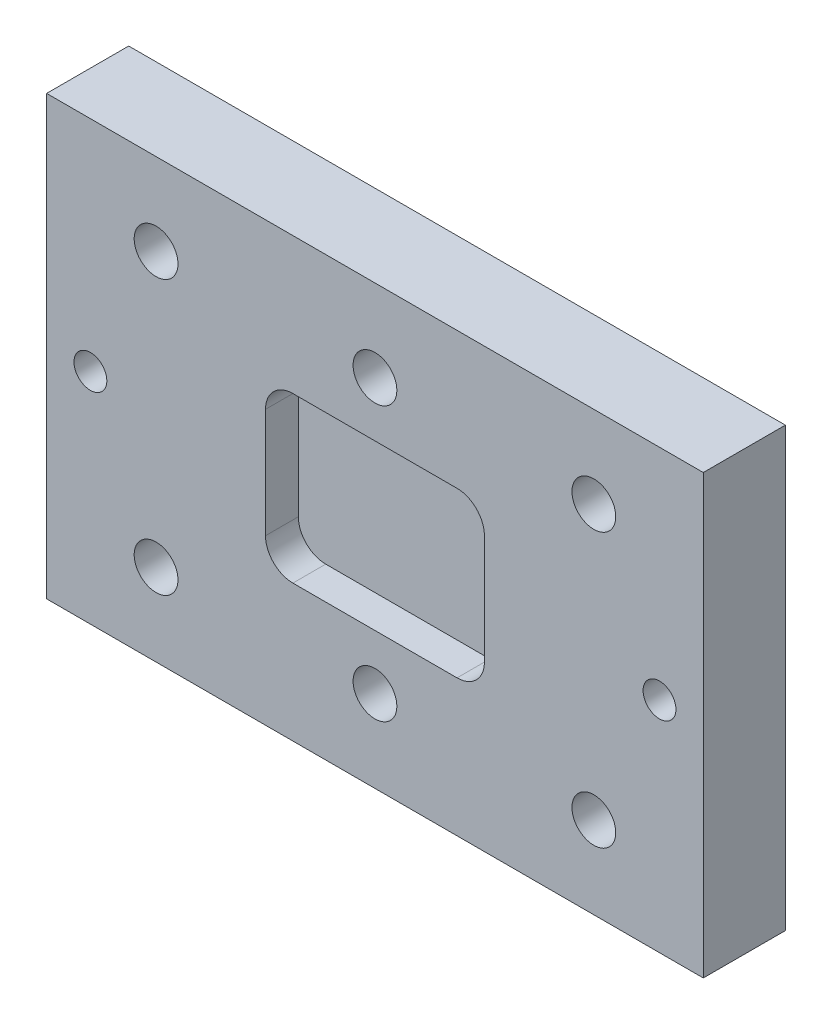
ISO-10303-21;
HEADER;
FILE_DESCRIPTION(('STEP AP214'),'2;1');
FILE_NAME('part.step','',(''),(''),'','','');
FILE_SCHEMA(('AUTOMOTIVE_DESIGN { 1 0 10303 214 1 1 1 1 }'));
ENDSEC;
DATA;
#1=APPLICATION_CONTEXT('core data for automotive mechanical design processes');
#2=APPLICATION_PROTOCOL_DEFINITION('international standard','automotive_design',2000,#1);
#3=PRODUCT_CONTEXT('',#1,'mechanical');
#4=PRODUCT('Part','Part','',(#3));
#5=PRODUCT_RELATED_PRODUCT_CATEGORY('part','',(#4));
#6=PRODUCT_DEFINITION_FORMATION('','',#4);
#7=PRODUCT_DEFINITION_CONTEXT('part definition',#1,'design');
#8=PRODUCT_DEFINITION('design','',#6,#7);
#9=PRODUCT_DEFINITION_SHAPE('','',#8);
#10=(LENGTH_UNIT() NAMED_UNIT(*) SI_UNIT(.MILLI.,.METRE.));
#11=(NAMED_UNIT(*) PLANE_ANGLE_UNIT() SI_UNIT($,.RADIAN.));
#12=(NAMED_UNIT(*) SI_UNIT($,.STERADIAN.) SOLID_ANGLE_UNIT());
#13=UNCERTAINTY_MEASURE_WITH_UNIT(LENGTH_MEASURE(1.E-05),#10,'distance_accuracy_value','');
#14=(GEOMETRIC_REPRESENTATION_CONTEXT(3) GLOBAL_UNCERTAINTY_ASSIGNED_CONTEXT((#13)) GLOBAL_UNIT_ASSIGNED_CONTEXT((#10,
#11,#12)) REPRESENTATION_CONTEXT('',''));
#15=CARTESIAN_POINT('',(0.,0.,0.));
#16=DIRECTION('',(0.,0.,1.));
#17=DIRECTION('',(1.,0.,0.));
#18=AXIS2_PLACEMENT_3D('',#15,#16,#17);
#19=CARTESIAN_POINT('',(-60.,40.,15.));
#20=DIRECTION('',(1.,0.,0.));
#21=DIRECTION('',(0.,0.,-1.));
#22=AXIS2_PLACEMENT_3D('',#19,#20,#21);
#23=PLANE('',#22);
#24=DIRECTION('',(0.,-1.,0.));
#25=VECTOR('',#24,1.);
#26=CARTESIAN_POINT('',(-60.,40.,0.));
#27=LINE('',#26,#25);
#28=CARTESIAN_POINT('',(-60.,40.,0.));
#29=VERTEX_POINT('',#28);
#30=CARTESIAN_POINT('',(-60.,-40.,0.));
#31=VERTEX_POINT('',#30);
#32=EDGE_CURVE('E230',#29,#31,#27,.T.);
#33=ORIENTED_EDGE('',*,*,#32,.T.);
#34=DIRECTION('',(0.,0.,-1.));
#35=VECTOR('',#34,1.);
#36=CARTESIAN_POINT('',(-60.,-40.,15.));
#37=LINE('',#36,#35);
#38=CARTESIAN_POINT('',(-60.,-40.,15.));
#39=VERTEX_POINT('',#38);
#40=EDGE_CURVE('E11',#39,#31,#37,.T.);
#41=ORIENTED_EDGE('',*,*,#40,.F.);
#42=DIRECTION('',(0.,-1.,0.));
#43=VECTOR('',#42,1.);
#44=CARTESIAN_POINT('',(-60.,40.,15.));
#45=LINE('',#44,#43);
#46=CARTESIAN_POINT('',(-60.,40.,15.));
#47=VERTEX_POINT('',#46);
#48=EDGE_CURVE('E248',#47,#39,#45,.T.);
#49=ORIENTED_EDGE('',*,*,#48,.F.);
#50=DIRECTION('',(0.,0.,-1.));
#51=VECTOR('',#50,1.);
#52=CARTESIAN_POINT('',(-60.,40.,15.));
#53=LINE('',#52,#51);
#54=EDGE_CURVE('E258',#47,#29,#53,.T.);
#55=ORIENTED_EDGE('',*,*,#54,.T.);
#56=EDGE_LOOP('',(#33,#41,#49,#55));
#57=FACE_BOUND('',#56,.T.);
#58=ADVANCED_FACE('F51',(#57),#23,.F.);
#59=CARTESIAN_POINT('',(-60.,-40.,15.));
#60=DIRECTION('',(0.,1.,0.));
#61=DIRECTION('',(0.,0.,1.));
#62=AXIS2_PLACEMENT_3D('',#59,#60,#61);
#63=PLANE('',#62);
#64=DIRECTION('',(1.,0.,0.));
#65=VECTOR('',#64,1.);
#66=CARTESIAN_POINT('',(-60.,-40.,0.));
#67=LINE('',#66,#65);
#68=CARTESIAN_POINT('',(60.,-40.,0.));
#69=VERTEX_POINT('',#68);
#70=EDGE_CURVE('E262',#31,#69,#67,.T.);
#71=ORIENTED_EDGE('',*,*,#70,.T.);
#72=DIRECTION('',(0.,0.,-1.));
#73=VECTOR('',#72,1.);
#74=CARTESIAN_POINT('',(60.,-40.,15.));
#75=LINE('',#74,#73);
#76=CARTESIAN_POINT('',(60.,-40.,15.));
#77=VERTEX_POINT('',#76);
#78=EDGE_CURVE('E59',#77,#69,#75,.T.);
#79=ORIENTED_EDGE('',*,*,#78,.F.);
#80=DIRECTION('',(1.,0.,0.));
#81=VECTOR('',#80,1.);
#82=CARTESIAN_POINT('',(-60.,-40.,15.));
#83=LINE('',#82,#81);
#84=EDGE_CURVE('E103',#39,#77,#83,.T.);
#85=ORIENTED_EDGE('',*,*,#84,.F.);
#86=ORIENTED_EDGE('',*,*,#40,.T.);
#87=EDGE_LOOP('',(#71,#79,#85,#86));
#88=FACE_BOUND('',#87,.T.);
#89=ADVANCED_FACE('F297',(#88),#63,.F.);
#90=CARTESIAN_POINT('',(60.,-40.,15.));
#91=DIRECTION('',(-1.,0.,0.));
#92=DIRECTION('',(0.,0.,1.));
#93=AXIS2_PLACEMENT_3D('',#90,#91,#92);
#94=PLANE('',#93);
#95=DIRECTION('',(0.,1.,0.));
#96=VECTOR('',#95,1.);
#97=CARTESIAN_POINT('',(60.,-40.,0.));
#98=LINE('',#97,#96);
#99=CARTESIAN_POINT('',(60.,40.,0.));
#100=VERTEX_POINT('',#99);
#101=EDGE_CURVE('E265',#69,#100,#98,.T.);
#102=ORIENTED_EDGE('',*,*,#101,.T.);
#103=DIRECTION('',(0.,0.,-1.));
#104=VECTOR('',#103,1.);
#105=CARTESIAN_POINT('',(60.,40.,15.));
#106=LINE('',#105,#104);
#107=CARTESIAN_POINT('',(60.,40.,15.));
#108=VERTEX_POINT('',#107);
#109=EDGE_CURVE('E272',#108,#100,#106,.T.);
#110=ORIENTED_EDGE('',*,*,#109,.F.);
#111=DIRECTION('',(0.,1.,0.));
#112=VECTOR('',#111,1.);
#113=CARTESIAN_POINT('',(60.,-40.,15.));
#114=LINE('',#113,#112);
#115=EDGE_CURVE('E253',#77,#108,#114,.T.);
#116=ORIENTED_EDGE('',*,*,#115,.F.);
#117=ORIENTED_EDGE('',*,*,#78,.T.);
#118=EDGE_LOOP('',(#102,#110,#116,#117));
#119=FACE_BOUND('',#118,.T.);
#120=ADVANCED_FACE('F280',(#119),#94,.F.);
#121=CARTESIAN_POINT('',(60.,40.,15.));
#122=DIRECTION('',(0.,-1.,0.));
#123=DIRECTION('',(0.,0.,-1.));
#124=AXIS2_PLACEMENT_3D('',#121,#122,#123);
#125=PLANE('',#124);
#126=DIRECTION('',(-1.,0.,0.));
#127=VECTOR('',#126,1.);
#128=CARTESIAN_POINT('',(60.,40.,0.));
#129=LINE('',#128,#127);
#130=EDGE_CURVE('E96',#100,#29,#129,.T.);
#131=ORIENTED_EDGE('',*,*,#130,.T.);
#132=ORIENTED_EDGE('',*,*,#54,.F.);
#133=DIRECTION('',(-1.,0.,0.));
#134=VECTOR('',#133,1.);
#135=CARTESIAN_POINT('',(60.,40.,15.));
#136=LINE('',#135,#134);
#137=EDGE_CURVE('E75',#108,#47,#136,.T.);
#138=ORIENTED_EDGE('',*,*,#137,.F.);
#139=ORIENTED_EDGE('',*,*,#109,.T.);
#140=EDGE_LOOP('',(#131,#132,#138,#139));
#141=FACE_BOUND('',#140,.T.);
#142=ADVANCED_FACE('F288',(#141),#125,.F.);
#143=CARTESIAN_POINT('',(0.,0.,15.));
#144=DIRECTION('',(0.,0.,1.));
#145=DIRECTION('',(1.,0.,0.));
#146=AXIS2_PLACEMENT_3D('',#143,#144,#145);
#147=PLANE('',#146);
#148=CARTESIAN_POINT('',(52.,0.,15.));
#149=DIRECTION('',(0.,0.,1.));
#150=DIRECTION('',(1.,0.,0.));
#151=AXIS2_PLACEMENT_3D('',#148,#149,#150);
#152=CIRCLE('',#151,3.);
#153=CARTESIAN_POINT('',(55.,0.,15.));
#154=VERTEX_POINT('',#153);
#155=EDGE_CURVE('E599',#154,#154,#152,.T.);
#156=ORIENTED_EDGE('',*,*,#155,.F.);
#157=EDGE_LOOP('',(#156));
#158=FACE_BOUND('',#157,.T.);
#159=CARTESIAN_POINT('',(-52.,0.,15.));
#160=DIRECTION('',(0.,0.,1.));
#161=DIRECTION('',(1.,0.,0.));
#162=AXIS2_PLACEMENT_3D('',#159,#160,#161);
#163=CIRCLE('',#162,3.);
#164=CARTESIAN_POINT('',(-49.,0.,15.));
#165=VERTEX_POINT('',#164);
#166=EDGE_CURVE('E607',#165,#165,#163,.T.);
#167=ORIENTED_EDGE('',*,*,#166,.F.);
#168=EDGE_LOOP('',(#167));
#169=FACE_BOUND('',#168,.T.);
#170=CARTESIAN_POINT('',(-40.,25.,15.));
#171=DIRECTION('',(0.,0.,1.));
#172=DIRECTION('',(1.,0.,0.));
#173=AXIS2_PLACEMENT_3D('',#170,#171,#172);
#174=CIRCLE('',#173,4.);
#175=CARTESIAN_POINT('',(-36.,25.,15.));
#176=VERTEX_POINT('',#175);
#177=EDGE_CURVE('E630',#176,#176,#174,.T.);
#178=ORIENTED_EDGE('',*,*,#177,.F.);
#179=EDGE_LOOP('',(#178));
#180=FACE_BOUND('',#179,.T.);
#181=CARTESIAN_POINT('',(40.,-25.,15.));
#182=DIRECTION('',(0.,0.,1.));
#183=DIRECTION('',(1.,0.,0.));
#184=AXIS2_PLACEMENT_3D('',#181,#182,#183);
#185=CIRCLE('',#184,4.);
#186=CARTESIAN_POINT('',(44.,-25.,15.));
#187=VERTEX_POINT('',#186);
#188=EDGE_CURVE('E621',#187,#187,#185,.T.);
#189=ORIENTED_EDGE('',*,*,#188,.F.);
#190=EDGE_LOOP('',(#189));
#191=FACE_BOUND('',#190,.T.);
#192=CARTESIAN_POINT('',(40.,25.,15.));
#193=DIRECTION('',(0.,0.,1.));
#194=DIRECTION('',(1.,0.,0.));
#195=AXIS2_PLACEMENT_3D('',#192,#193,#194);
#196=CIRCLE('',#195,4.);
#197=CARTESIAN_POINT('',(44.,25.,15.));
#198=VERTEX_POINT('',#197);
#199=EDGE_CURVE('E645',#198,#198,#196,.T.);
#200=ORIENTED_EDGE('',*,*,#199,.F.);
#201=EDGE_LOOP('',(#200));
#202=FACE_BOUND('',#201,.T.);
#203=CARTESIAN_POINT('',(0.,-25.,15.));
#204=DIRECTION('',(0.,0.,1.));
#205=DIRECTION('',(1.,0.,0.));
#206=AXIS2_PLACEMENT_3D('',#203,#204,#205);
#207=CIRCLE('',#206,4.);
#208=CARTESIAN_POINT('',(4.,-25.,15.));
#209=VERTEX_POINT('',#208);
#210=EDGE_CURVE('E637',#209,#209,#207,.T.);
#211=ORIENTED_EDGE('',*,*,#210,.F.);
#212=EDGE_LOOP('',(#211));
#213=FACE_BOUND('',#212,.T.);
#214=CARTESIAN_POINT('',(-40.,-25.,15.));
#215=DIRECTION('',(0.,0.,1.));
#216=DIRECTION('',(1.,0.,0.));
#217=AXIS2_PLACEMENT_3D('',#214,#215,#216);
#218=CIRCLE('',#217,4.);
#219=CARTESIAN_POINT('',(-36.,-25.,15.));
#220=VERTEX_POINT('',#219);
#221=EDGE_CURVE('E603',#220,#220,#218,.T.);
#222=ORIENTED_EDGE('',*,*,#221,.F.);
#223=EDGE_LOOP('',(#222));
#224=FACE_BOUND('',#223,.T.);
#225=CARTESIAN_POINT('',(0.,25.,15.));
#226=DIRECTION('',(0.,0.,1.));
#227=DIRECTION('',(1.,0.,0.));
#228=AXIS2_PLACEMENT_3D('',#225,#226,#227);
#229=CIRCLE('',#228,4.);
#230=CARTESIAN_POINT('',(4.,25.,15.));
#231=VERTEX_POINT('',#230);
#232=EDGE_CURVE('E180',#231,#231,#229,.T.);
#233=ORIENTED_EDGE('',*,*,#232,.F.);
#234=EDGE_LOOP('',(#233));
#235=FACE_BOUND('',#234,.T.);
#236=CARTESIAN_POINT('',(-15.,-9.99999999999999,15.));
#237=DIRECTION('',(0.,0.,1.));
#238=DIRECTION('',(1.,0.,0.));
#239=AXIS2_PLACEMENT_3D('',#236,#237,#238);
#240=CIRCLE('',#239,5.);
#241=CARTESIAN_POINT('',(-20.,-10.,15.));
#242=VERTEX_POINT('',#241);
#243=CARTESIAN_POINT('',(-15.,-15.,15.));
#244=VERTEX_POINT('',#243);
#245=EDGE_CURVE('E66',#242,#244,#240,.T.);
#246=ORIENTED_EDGE('',*,*,#245,.F.);
#247=DIRECTION('',(0.,-1.,0.));
#248=VECTOR('',#247,1.);
#249=CARTESIAN_POINT('',(-20.,10.,15.));
#250=LINE('',#249,#248);
#251=CARTESIAN_POINT('',(-20.,10.,15.));
#252=VERTEX_POINT('',#251);
#253=EDGE_CURVE('E173',#252,#242,#250,.T.);
#254=ORIENTED_EDGE('',*,*,#253,.F.);
#255=CARTESIAN_POINT('',(-15.,9.99999999999999,15.));
#256=DIRECTION('',(0.,0.,1.));
#257=DIRECTION('',(1.,0.,0.));
#258=AXIS2_PLACEMENT_3D('',#255,#256,#257);
#259=CIRCLE('',#258,5.);
#260=CARTESIAN_POINT('',(-15.,15.,15.));
#261=VERTEX_POINT('',#260);
#262=EDGE_CURVE('E177',#261,#252,#259,.T.);
#263=ORIENTED_EDGE('',*,*,#262,.F.);
#264=DIRECTION('',(-1.,0.,0.));
#265=VECTOR('',#264,1.);
#266=CARTESIAN_POINT('',(15.,15.,15.));
#267=LINE('',#266,#265);
#268=CARTESIAN_POINT('',(15.,15.,15.));
#269=VERTEX_POINT('',#268);
#270=EDGE_CURVE('E220',#269,#261,#267,.T.);
#271=ORIENTED_EDGE('',*,*,#270,.F.);
#272=CARTESIAN_POINT('',(15.,9.99999999999999,15.));
#273=DIRECTION('',(0.,0.,1.));
#274=DIRECTION('',(1.,0.,0.));
#275=AXIS2_PLACEMENT_3D('',#272,#273,#274);
#276=CIRCLE('',#275,5.);
#277=CARTESIAN_POINT('',(20.,10.,15.));
#278=VERTEX_POINT('',#277);
#279=EDGE_CURVE('E216',#278,#269,#276,.T.);
#280=ORIENTED_EDGE('',*,*,#279,.F.);
#281=DIRECTION('',(0.,1.,0.));
#282=VECTOR('',#281,1.);
#283=CARTESIAN_POINT('',(20.,-10.,15.));
#284=LINE('',#283,#282);
#285=CARTESIAN_POINT('',(20.,-10.,15.));
#286=VERTEX_POINT('',#285);
#287=EDGE_CURVE('E212',#286,#278,#284,.T.);
#288=ORIENTED_EDGE('',*,*,#287,.F.);
#289=CARTESIAN_POINT('',(15.,-9.99999999999999,15.));
#290=DIRECTION('',(0.,0.,1.));
#291=DIRECTION('',(1.,0.,0.));
#292=AXIS2_PLACEMENT_3D('',#289,#290,#291);
#293=CIRCLE('',#292,5.);
#294=CARTESIAN_POINT('',(15.,-15.,15.));
#295=VERTEX_POINT('',#294);
#296=EDGE_CURVE('E208',#295,#286,#293,.T.);
#297=ORIENTED_EDGE('',*,*,#296,.F.);
#298=DIRECTION('',(1.,0.,0.));
#299=VECTOR('',#298,1.);
#300=CARTESIAN_POINT('',(-15.,-15.,15.));
#301=LINE('',#300,#299);
#302=EDGE_CURVE('E204',#244,#295,#301,.T.);
#303=ORIENTED_EDGE('',*,*,#302,.F.);
#304=EDGE_LOOP('',(#246,#254,#263,#271,#280,#288,#297,#303));
#305=FACE_BOUND('',#304,.T.);
#306=ORIENTED_EDGE('',*,*,#48,.T.);
#307=ORIENTED_EDGE('',*,*,#84,.T.);
#308=ORIENTED_EDGE('',*,*,#115,.T.);
#309=ORIENTED_EDGE('',*,*,#137,.T.);
#310=EDGE_LOOP('',(#306,#307,#308,#309));
#311=FACE_BOUND('',#310,.T.);
#312=ADVANCED_FACE('F290',(#158,#169,#180,#191,#202,#213,#224,#235,#305,#311),#147,.T.);
#313=CARTESIAN_POINT('',(0.,0.,0.));
#314=DIRECTION('',(0.,0.,1.));
#315=DIRECTION('',(1.,0.,0.));
#316=AXIS2_PLACEMENT_3D('',#313,#314,#315);
#317=PLANE('',#316);
#318=CARTESIAN_POINT('',(-40.,25.,0.));
#319=DIRECTION('',(0.,0.,1.));
#320=DIRECTION('',(1.,0.,0.));
#321=AXIS2_PLACEMENT_3D('',#318,#319,#320);
#322=CIRCLE('',#321,4.);
#323=CARTESIAN_POINT('',(-36.,25.,0.));
#324=VERTEX_POINT('',#323);
#325=EDGE_CURVE('E619',#324,#324,#322,.T.);
#326=ORIENTED_EDGE('',*,*,#325,.T.);
#327=EDGE_LOOP('',(#326));
#328=FACE_BOUND('',#327,.T.);
#329=CARTESIAN_POINT('',(40.,-25.,0.));
#330=DIRECTION('',(0.,0.,1.));
#331=DIRECTION('',(1.,0.,0.));
#332=AXIS2_PLACEMENT_3D('',#329,#330,#331);
#333=CIRCLE('',#332,4.);
#334=CARTESIAN_POINT('',(44.,-25.,0.));
#335=VERTEX_POINT('',#334);
#336=EDGE_CURVE('E626',#335,#335,#333,.T.);
#337=ORIENTED_EDGE('',*,*,#336,.T.);
#338=EDGE_LOOP('',(#337));
#339=FACE_BOUND('',#338,.T.);
#340=CARTESIAN_POINT('',(40.,25.,0.));
#341=DIRECTION('',(0.,0.,1.));
#342=DIRECTION('',(1.,0.,0.));
#343=AXIS2_PLACEMENT_3D('',#340,#341,#342);
#344=CIRCLE('',#343,4.);
#345=CARTESIAN_POINT('',(44.,25.,0.));
#346=VERTEX_POINT('',#345);
#347=EDGE_CURVE('E625',#346,#346,#344,.T.);
#348=ORIENTED_EDGE('',*,*,#347,.T.);
#349=EDGE_LOOP('',(#348));
#350=FACE_BOUND('',#349,.T.);
#351=CARTESIAN_POINT('',(0.,-25.,0.));
#352=DIRECTION('',(0.,0.,1.));
#353=DIRECTION('',(1.,0.,0.));
#354=AXIS2_PLACEMENT_3D('',#351,#352,#353);
#355=CIRCLE('',#354,4.);
#356=CARTESIAN_POINT('',(4.,-25.,0.));
#357=VERTEX_POINT('',#356);
#358=EDGE_CURVE('E641',#357,#357,#355,.T.);
#359=ORIENTED_EDGE('',*,*,#358,.T.);
#360=EDGE_LOOP('',(#359));
#361=FACE_BOUND('',#360,.T.);
#362=CARTESIAN_POINT('',(-40.,-25.,0.));
#363=DIRECTION('',(0.,0.,1.));
#364=DIRECTION('',(1.,0.,0.));
#365=AXIS2_PLACEMENT_3D('',#362,#363,#364);
#366=CIRCLE('',#365,4.);
#367=CARTESIAN_POINT('',(-36.,-25.,0.));
#368=VERTEX_POINT('',#367);
#369=EDGE_CURVE('E598',#368,#368,#366,.T.);
#370=ORIENTED_EDGE('',*,*,#369,.T.);
#371=EDGE_LOOP('',(#370));
#372=FACE_BOUND('',#371,.T.);
#373=CARTESIAN_POINT('',(0.,25.,0.));
#374=DIRECTION('',(0.,0.,1.));
#375=DIRECTION('',(1.,0.,0.));
#376=AXIS2_PLACEMENT_3D('',#373,#374,#375);
#377=CIRCLE('',#376,4.);
#378=CARTESIAN_POINT('',(4.,25.,0.));
#379=VERTEX_POINT('',#378);
#380=EDGE_CURVE('E205',#379,#379,#377,.T.);
#381=ORIENTED_EDGE('',*,*,#380,.T.);
#382=EDGE_LOOP('',(#381));
#383=FACE_BOUND('',#382,.T.);
#384=ORIENTED_EDGE('',*,*,#32,.F.);
#385=ORIENTED_EDGE('',*,*,#130,.F.);
#386=ORIENTED_EDGE('',*,*,#101,.F.);
#387=ORIENTED_EDGE('',*,*,#70,.F.);
#388=EDGE_LOOP('',(#384,#385,#386,#387));
#389=FACE_BOUND('',#388,.T.);
#390=ADVANCED_FACE('F284',(#328,#339,#350,#361,#372,#383,#389),#317,.F.);
#391=CARTESIAN_POINT('',(-15.,-9.99999999999999,9.));
#392=DIRECTION('',(0.,0.,1.));
#393=DIRECTION('',(1.,0.,0.));
#394=AXIS2_PLACEMENT_3D('',#391,#392,#393);
#395=CYLINDRICAL_SURFACE('',#394,5.);
#396=ORIENTED_EDGE('',*,*,#245,.T.);
#397=DIRECTION('',(0.,0.,1.));
#398=VECTOR('',#397,1.);
#399=CARTESIAN_POINT('',(-15.,-15.,9.));
#400=LINE('',#399,#398);
#401=CARTESIAN_POINT('',(-15.,-15.,9.));
#402=VERTEX_POINT('',#401);
#403=EDGE_CURVE('E147',#402,#244,#400,.T.);
#404=ORIENTED_EDGE('',*,*,#403,.F.);
#405=CARTESIAN_POINT('',(-15.,-9.99999999999999,9.));
#406=DIRECTION('',(0.,0.,1.));
#407=DIRECTION('',(1.,0.,0.));
#408=AXIS2_PLACEMENT_3D('',#405,#406,#407);
#409=CIRCLE('',#408,5.);
#410=CARTESIAN_POINT('',(-20.,-10.,9.));
#411=VERTEX_POINT('',#410);
#412=EDGE_CURVE('E151',#411,#402,#409,.T.);
#413=ORIENTED_EDGE('',*,*,#412,.F.);
#414=DIRECTION('',(0.,0.,1.));
#415=VECTOR('',#414,1.);
#416=CARTESIAN_POINT('',(-20.,-10.,9.));
#417=LINE('',#416,#415);
#418=EDGE_CURVE('E227',#411,#242,#417,.T.);
#419=ORIENTED_EDGE('',*,*,#418,.T.);
#420=EDGE_LOOP('',(#396,#404,#413,#419));
#421=FACE_BOUND('',#420,.T.);
#422=ADVANCED_FACE('F149',(#421),#395,.F.);
#423=CARTESIAN_POINT('',(-20.,10.,9.));
#424=DIRECTION('',(-1.,0.,0.));
#425=DIRECTION('',(0.,0.,1.));
#426=AXIS2_PLACEMENT_3D('',#423,#424,#425);
#427=PLANE('',#426);
#428=ORIENTED_EDGE('',*,*,#253,.T.);
#429=ORIENTED_EDGE('',*,*,#418,.F.);
#430=DIRECTION('',(0.,-1.,0.));
#431=VECTOR('',#430,1.);
#432=CARTESIAN_POINT('',(-20.,10.,9.));
#433=LINE('',#432,#431);
#434=CARTESIAN_POINT('',(-20.,10.,9.));
#435=VERTEX_POINT('',#434);
#436=EDGE_CURVE('E158',#435,#411,#433,.T.);
#437=ORIENTED_EDGE('',*,*,#436,.F.);
#438=DIRECTION('',(0.,0.,1.));
#439=VECTOR('',#438,1.);
#440=CARTESIAN_POINT('',(-20.,10.,9.));
#441=LINE('',#440,#439);
#442=EDGE_CURVE('E231',#435,#252,#441,.T.);
#443=ORIENTED_EDGE('',*,*,#442,.T.);
#444=EDGE_LOOP('',(#428,#429,#437,#443));
#445=FACE_BOUND('',#444,.T.);
#446=ADVANCED_FACE('F331',(#445),#427,.F.);
#447=CARTESIAN_POINT('',(-15.,9.99999999999999,9.));
#448=DIRECTION('',(0.,0.,1.));
#449=DIRECTION('',(1.,0.,0.));
#450=AXIS2_PLACEMENT_3D('',#447,#448,#449);
#451=CYLINDRICAL_SURFACE('',#450,5.);
#452=ORIENTED_EDGE('',*,*,#262,.T.);
#453=ORIENTED_EDGE('',*,*,#442,.F.);
#454=CARTESIAN_POINT('',(-15.,9.99999999999999,9.));
#455=DIRECTION('',(0.,0.,1.));
#456=DIRECTION('',(1.,0.,0.));
#457=AXIS2_PLACEMENT_3D('',#454,#455,#456);
#458=CIRCLE('',#457,5.);
#459=CARTESIAN_POINT('',(-15.,15.,9.));
#460=VERTEX_POINT('',#459);
#461=EDGE_CURVE('E197',#460,#435,#458,.T.);
#462=ORIENTED_EDGE('',*,*,#461,.F.);
#463=DIRECTION('',(0.,0.,1.));
#464=VECTOR('',#463,1.);
#465=CARTESIAN_POINT('',(-15.,15.,9.));
#466=LINE('',#465,#464);
#467=EDGE_CURVE('E234',#460,#261,#466,.T.);
#468=ORIENTED_EDGE('',*,*,#467,.T.);
#469=EDGE_LOOP('',(#452,#453,#462,#468));
#470=FACE_BOUND('',#469,.T.);
#471=ADVANCED_FACE('F338',(#470),#451,.F.);
#472=CARTESIAN_POINT('',(15.,15.,9.));
#473=DIRECTION('',(0.,1.,0.));
#474=DIRECTION('',(0.,0.,1.));
#475=AXIS2_PLACEMENT_3D('',#472,#473,#474);
#476=PLANE('',#475);
#477=ORIENTED_EDGE('',*,*,#270,.T.);
#478=ORIENTED_EDGE('',*,*,#467,.F.);
#479=DIRECTION('',(-1.,0.,0.));
#480=VECTOR('',#479,1.);
#481=CARTESIAN_POINT('',(15.,15.,9.));
#482=LINE('',#481,#480);
#483=CARTESIAN_POINT('',(15.,15.,9.));
#484=VERTEX_POINT('',#483);
#485=EDGE_CURVE('E193',#484,#460,#482,.T.);
#486=ORIENTED_EDGE('',*,*,#485,.F.);
#487=DIRECTION('',(0.,0.,1.));
#488=VECTOR('',#487,1.);
#489=CARTESIAN_POINT('',(15.,15.,9.));
#490=LINE('',#489,#488);
#491=EDGE_CURVE('E237',#484,#269,#490,.T.);
#492=ORIENTED_EDGE('',*,*,#491,.T.);
#493=EDGE_LOOP('',(#477,#478,#486,#492));
#494=FACE_BOUND('',#493,.T.);
#495=ADVANCED_FACE('F346',(#494),#476,.F.);
#496=CARTESIAN_POINT('',(15.,9.99999999999999,9.));
#497=DIRECTION('',(0.,0.,1.));
#498=DIRECTION('',(1.,0.,0.));
#499=AXIS2_PLACEMENT_3D('',#496,#497,#498);
#500=CYLINDRICAL_SURFACE('',#499,5.);
#501=ORIENTED_EDGE('',*,*,#279,.T.);
#502=ORIENTED_EDGE('',*,*,#491,.F.);
#503=CARTESIAN_POINT('',(15.,9.99999999999999,9.));
#504=DIRECTION('',(0.,0.,1.));
#505=DIRECTION('',(1.,0.,0.));
#506=AXIS2_PLACEMENT_3D('',#503,#504,#505);
#507=CIRCLE('',#506,5.);
#508=CARTESIAN_POINT('',(20.,10.,9.));
#509=VERTEX_POINT('',#508);
#510=EDGE_CURVE('E189',#509,#484,#507,.T.);
#511=ORIENTED_EDGE('',*,*,#510,.F.);
#512=DIRECTION('',(0.,0.,1.));
#513=VECTOR('',#512,1.);
#514=CARTESIAN_POINT('',(20.,10.,9.));
#515=LINE('',#514,#513);
#516=EDGE_CURVE('E240',#509,#278,#515,.T.);
#517=ORIENTED_EDGE('',*,*,#516,.T.);
#518=EDGE_LOOP('',(#501,#502,#511,#517));
#519=FACE_BOUND('',#518,.T.);
#520=ADVANCED_FACE('F354',(#519),#500,.F.);
#521=CARTESIAN_POINT('',(20.,-10.,9.));
#522=DIRECTION('',(1.,0.,0.));
#523=DIRECTION('',(0.,0.,-1.));
#524=AXIS2_PLACEMENT_3D('',#521,#522,#523);
#525=PLANE('',#524);
#526=ORIENTED_EDGE('',*,*,#287,.T.);
#527=ORIENTED_EDGE('',*,*,#516,.F.);
#528=DIRECTION('',(0.,1.,0.));
#529=VECTOR('',#528,1.);
#530=CARTESIAN_POINT('',(20.,-10.,9.));
#531=LINE('',#530,#529);
#532=CARTESIAN_POINT('',(20.,-10.,9.));
#533=VERTEX_POINT('',#532);
#534=EDGE_CURVE('E185',#533,#509,#531,.T.);
#535=ORIENTED_EDGE('',*,*,#534,.F.);
#536=DIRECTION('',(0.,0.,1.));
#537=VECTOR('',#536,1.);
#538=CARTESIAN_POINT('',(20.,-10.,9.));
#539=LINE('',#538,#537);
#540=EDGE_CURVE('E243',#533,#286,#539,.T.);
#541=ORIENTED_EDGE('',*,*,#540,.T.);
#542=EDGE_LOOP('',(#526,#527,#535,#541));
#543=FACE_BOUND('',#542,.T.);
#544=ADVANCED_FACE('F362',(#543),#525,.F.);
#545=CARTESIAN_POINT('',(15.,-9.99999999999999,9.));
#546=DIRECTION('',(0.,0.,1.));
#547=DIRECTION('',(1.,0.,0.));
#548=AXIS2_PLACEMENT_3D('',#545,#546,#547);
#549=CYLINDRICAL_SURFACE('',#548,5.);
#550=ORIENTED_EDGE('',*,*,#296,.T.);
#551=ORIENTED_EDGE('',*,*,#540,.F.);
#552=CARTESIAN_POINT('',(15.,-9.99999999999999,9.));
#553=DIRECTION('',(0.,0.,1.));
#554=DIRECTION('',(1.,0.,0.));
#555=AXIS2_PLACEMENT_3D('',#552,#553,#554);
#556=CIRCLE('',#555,5.);
#557=CARTESIAN_POINT('',(15.,-15.,9.));
#558=VERTEX_POINT('',#557);
#559=EDGE_CURVE('E167',#558,#533,#556,.T.);
#560=ORIENTED_EDGE('',*,*,#559,.F.);
#561=DIRECTION('',(0.,0.,1.));
#562=VECTOR('',#561,1.);
#563=CARTESIAN_POINT('',(15.,-15.,9.));
#564=LINE('',#563,#562);
#565=EDGE_CURVE('E157',#558,#295,#564,.T.);
#566=ORIENTED_EDGE('',*,*,#565,.T.);
#567=EDGE_LOOP('',(#550,#551,#560,#566));
#568=FACE_BOUND('',#567,.T.);
#569=ADVANCED_FACE('F370',(#568),#549,.F.);
#570=CARTESIAN_POINT('',(-15.,-15.,9.));
#571=DIRECTION('',(0.,-1.,0.));
#572=DIRECTION('',(0.,0.,-1.));
#573=AXIS2_PLACEMENT_3D('',#570,#571,#572);
#574=PLANE('',#573);
#575=ORIENTED_EDGE('',*,*,#302,.T.);
#576=ORIENTED_EDGE('',*,*,#565,.F.);
#577=DIRECTION('',(1.,0.,0.));
#578=VECTOR('',#577,1.);
#579=CARTESIAN_POINT('',(-15.,-15.,9.));
#580=LINE('',#579,#578);
#581=EDGE_CURVE('E161',#402,#558,#580,.T.);
#582=ORIENTED_EDGE('',*,*,#581,.F.);
#583=ORIENTED_EDGE('',*,*,#403,.T.);
#584=EDGE_LOOP('',(#575,#576,#582,#583));
#585=FACE_BOUND('',#584,.T.);
#586=ADVANCED_FACE('F162',(#585),#574,.F.);
#587=CARTESIAN_POINT('',(-15.,-9.99999999999999,9.));
#588=DIRECTION('',(0.,0.,1.));
#589=DIRECTION('',(1.,0.,0.));
#590=AXIS2_PLACEMENT_3D('',#587,#588,#589);
#591=PLANE('',#590);
#592=ORIENTED_EDGE('',*,*,#412,.T.);
#593=ORIENTED_EDGE('',*,*,#581,.T.);
#594=ORIENTED_EDGE('',*,*,#559,.T.);
#595=ORIENTED_EDGE('',*,*,#534,.T.);
#596=ORIENTED_EDGE('',*,*,#510,.T.);
#597=ORIENTED_EDGE('',*,*,#485,.T.);
#598=ORIENTED_EDGE('',*,*,#461,.T.);
#599=ORIENTED_EDGE('',*,*,#436,.T.);
#600=EDGE_LOOP('',(#592,#593,#594,#595,#596,#597,#598,#599));
#601=FACE_BOUND('',#600,.T.);
#602=ADVANCED_FACE('F169',(#601),#591,.T.);
#603=CARTESIAN_POINT('',(0.,25.,0.));
#604=DIRECTION('',(0.,0.,1.));
#605=DIRECTION('',(1.,0.,0.));
#606=AXIS2_PLACEMENT_3D('',#603,#604,#605);
#607=CYLINDRICAL_SURFACE('',#606,4.);
#608=ORIENTED_EDGE('',*,*,#380,.F.);
#609=EDGE_LOOP('',(#608));
#610=FACE_BOUND('',#609,.T.);
#611=ORIENTED_EDGE('',*,*,#232,.T.);
#612=EDGE_LOOP('',(#611));
#613=FACE_BOUND('',#612,.T.);
#614=ADVANCED_FACE('F390',(#610,#613),#607,.F.);
#615=CARTESIAN_POINT('',(-40.,-25.,0.));
#616=DIRECTION('',(0.,0.,1.));
#617=DIRECTION('',(1.,0.,0.));
#618=AXIS2_PLACEMENT_3D('',#615,#616,#617);
#619=CYLINDRICAL_SURFACE('',#618,4.);
#620=ORIENTED_EDGE('',*,*,#369,.F.);
#621=EDGE_LOOP('',(#620));
#622=FACE_BOUND('',#621,.T.);
#623=ORIENTED_EDGE('',*,*,#221,.T.);
#624=EDGE_LOOP('',(#623));
#625=FACE_BOUND('',#624,.T.);
#626=ADVANCED_FACE('F396',(#622,#625),#619,.F.);
#627=CARTESIAN_POINT('',(0.,-25.,0.));
#628=DIRECTION('',(0.,0.,1.));
#629=DIRECTION('',(1.,0.,0.));
#630=AXIS2_PLACEMENT_3D('',#627,#628,#629);
#631=CYLINDRICAL_SURFACE('',#630,4.);
#632=ORIENTED_EDGE('',*,*,#358,.F.);
#633=EDGE_LOOP('',(#632));
#634=FACE_BOUND('',#633,.T.);
#635=ORIENTED_EDGE('',*,*,#210,.T.);
#636=EDGE_LOOP('',(#635));
#637=FACE_BOUND('',#636,.T.);
#638=ADVANCED_FACE('F404',(#634,#637),#631,.F.);
#639=CARTESIAN_POINT('',(40.,25.,0.));
#640=DIRECTION('',(0.,0.,1.));
#641=DIRECTION('',(1.,0.,0.));
#642=AXIS2_PLACEMENT_3D('',#639,#640,#641);
#643=CYLINDRICAL_SURFACE('',#642,4.);
#644=ORIENTED_EDGE('',*,*,#347,.F.);
#645=EDGE_LOOP('',(#644));
#646=FACE_BOUND('',#645,.T.);
#647=ORIENTED_EDGE('',*,*,#199,.T.);
#648=EDGE_LOOP('',(#647));
#649=FACE_BOUND('',#648,.T.);
#650=ADVANCED_FACE('F412',(#646,#649),#643,.F.);
#651=CARTESIAN_POINT('',(40.,-25.,0.));
#652=DIRECTION('',(0.,0.,1.));
#653=DIRECTION('',(1.,0.,0.));
#654=AXIS2_PLACEMENT_3D('',#651,#652,#653);
#655=CYLINDRICAL_SURFACE('',#654,4.);
#656=ORIENTED_EDGE('',*,*,#336,.F.);
#657=EDGE_LOOP('',(#656));
#658=FACE_BOUND('',#657,.T.);
#659=ORIENTED_EDGE('',*,*,#188,.T.);
#660=EDGE_LOOP('',(#659));
#661=FACE_BOUND('',#660,.T.);
#662=ADVANCED_FACE('F420',(#658,#661),#655,.F.);
#663=CARTESIAN_POINT('',(-40.,25.,0.));
#664=DIRECTION('',(0.,0.,1.));
#665=DIRECTION('',(1.,0.,0.));
#666=AXIS2_PLACEMENT_3D('',#663,#664,#665);
#667=CYLINDRICAL_SURFACE('',#666,4.);
#668=ORIENTED_EDGE('',*,*,#325,.F.);
#669=EDGE_LOOP('',(#668));
#670=FACE_BOUND('',#669,.T.);
#671=ORIENTED_EDGE('',*,*,#177,.T.);
#672=EDGE_LOOP('',(#671));
#673=FACE_BOUND('',#672,.T.);
#674=ADVANCED_FACE('F428',(#670,#673),#667,.F.);
#675=CARTESIAN_POINT('',(-52.,0.,5.));
#676=DIRECTION('',(0.,0.,1.));
#677=DIRECTION('',(1.,0.,0.));
#678=AXIS2_PLACEMENT_3D('',#675,#676,#677);
#679=CYLINDRICAL_SURFACE('',#678,3.);
#680=CARTESIAN_POINT('',(-52.,0.,5.));
#681=DIRECTION('',(0.,0.,1.));
#682=DIRECTION('',(1.,0.,0.));
#683=AXIS2_PLACEMENT_3D('',#680,#681,#682);
#684=CIRCLE('',#683,3.);
#685=CARTESIAN_POINT('',(-49.,0.,5.));
#686=VERTEX_POINT('',#685);
#687=EDGE_CURVE('E613',#686,#686,#684,.T.);
#688=ORIENTED_EDGE('',*,*,#687,.F.);
#689=EDGE_LOOP('',(#688));
#690=FACE_BOUND('',#689,.T.);
#691=ORIENTED_EDGE('',*,*,#166,.T.);
#692=EDGE_LOOP('',(#691));
#693=FACE_BOUND('',#692,.T.);
#694=ADVANCED_FACE('F435',(#690,#693),#679,.F.);
#695=CARTESIAN_POINT('',(-52.,0.,5.));
#696=DIRECTION('',(0.,0.,1.));
#697=DIRECTION('',(1.,0.,0.));
#698=AXIS2_PLACEMENT_3D('',#695,#696,#697);
#699=PLANE('',#698);
#700=ORIENTED_EDGE('',*,*,#687,.T.);
#701=EDGE_LOOP('',(#700));
#702=FACE_BOUND('',#701,.T.);
#703=ADVANCED_FACE('F442',(#702),#699,.T.);
#704=CARTESIAN_POINT('',(52.,0.,5.));
#705=DIRECTION('',(0.,0.,1.));
#706=DIRECTION('',(1.,0.,0.));
#707=AXIS2_PLACEMENT_3D('',#704,#705,#706);
#708=CYLINDRICAL_SURFACE('',#707,3.);
#709=CARTESIAN_POINT('',(52.,0.,5.));
#710=DIRECTION('',(0.,0.,1.));
#711=DIRECTION('',(1.,0.,0.));
#712=AXIS2_PLACEMENT_3D('',#709,#710,#711);
#713=CIRCLE('',#712,3.);
#714=CARTESIAN_POINT('',(55.,0.,5.));
#715=VERTEX_POINT('',#714);
#716=EDGE_CURVE('E597',#715,#715,#713,.T.);
#717=ORIENTED_EDGE('',*,*,#716,.F.);
#718=EDGE_LOOP('',(#717));
#719=FACE_BOUND('',#718,.T.);
#720=ORIENTED_EDGE('',*,*,#155,.T.);
#721=EDGE_LOOP('',(#720));
#722=FACE_BOUND('',#721,.T.);
#723=ADVANCED_FACE('F450',(#719,#722),#708,.F.);
#724=CARTESIAN_POINT('',(52.,0.,5.));
#725=DIRECTION('',(0.,0.,1.));
#726=DIRECTION('',(1.,0.,0.));
#727=AXIS2_PLACEMENT_3D('',#724,#725,#726);
#728=PLANE('',#727);
#729=ORIENTED_EDGE('',*,*,#716,.T.);
#730=EDGE_LOOP('',(#729));
#731=FACE_BOUND('',#730,.T.);
#732=ADVANCED_FACE('F458',(#731),#728,.T.);
#733=CLOSED_SHELL('',(#58,#89,#120,#142,#312,#390,#422,#446,#471,#495,#520,#544,#569,#586,#602,
#614,#626,#638,#650,#662,#674,#694,#703,#723,#732));
#734=MANIFOLD_SOLID_BREP('B2',#733);
#735=ADVANCED_BREP_SHAPE_REPRESENTATION('',(#18,#734),#14);
#736=SHAPE_DEFINITION_REPRESENTATION(#9,#735);
ENDSEC;
END-ISO-10303-21;
